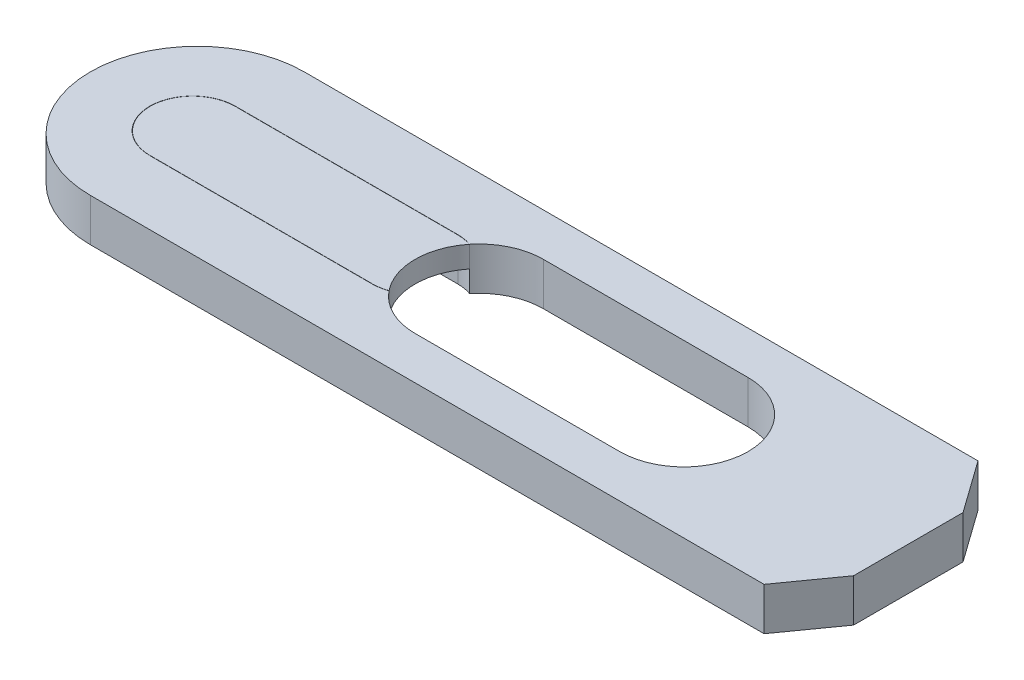
ISO-10303-21;
HEADER;
FILE_DESCRIPTION(('STEP AP214'),'2;1');
FILE_NAME('part.step','',(''),(''),'','','');
FILE_SCHEMA(('AUTOMOTIVE_DESIGN { 1 0 10303 214 1 1 1 1 }'));
ENDSEC;
DATA;
#1=APPLICATION_CONTEXT('core data for automotive mechanical design processes');
#2=APPLICATION_PROTOCOL_DEFINITION('international standard','automotive_design',2000,#1);
#3=PRODUCT_CONTEXT('',#1,'mechanical');
#4=PRODUCT('Part','Part','',(#3));
#5=PRODUCT_RELATED_PRODUCT_CATEGORY('part','',(#4));
#6=PRODUCT_DEFINITION_FORMATION('','',#4);
#7=PRODUCT_DEFINITION_CONTEXT('part definition',#1,'design');
#8=PRODUCT_DEFINITION('design','',#6,#7);
#9=PRODUCT_DEFINITION_SHAPE('','',#8);
#10=(LENGTH_UNIT() NAMED_UNIT(*) SI_UNIT(.MILLI.,.METRE.));
#11=(NAMED_UNIT(*) PLANE_ANGLE_UNIT() SI_UNIT($,.RADIAN.));
#12=(NAMED_UNIT(*) SI_UNIT($,.STERADIAN.) SOLID_ANGLE_UNIT());
#13=UNCERTAINTY_MEASURE_WITH_UNIT(LENGTH_MEASURE(1.E-05),#10,'distance_accuracy_value','');
#14=(GEOMETRIC_REPRESENTATION_CONTEXT(3) GLOBAL_UNCERTAINTY_ASSIGNED_CONTEXT((#13)) GLOBAL_UNIT_ASSIGNED_CONTEXT((#10,
#11,#12)) REPRESENTATION_CONTEXT('',''));
#15=CARTESIAN_POINT('',(0.,0.,0.));
#16=DIRECTION('',(0.,0.,1.));
#17=DIRECTION('',(1.,0.,0.));
#18=AXIS2_PLACEMENT_3D('',#15,#16,#17);
#19=CARTESIAN_POINT('',(-14.1439504513353,2.54,-2.53999999999999));
#20=DIRECTION('',(0.,1.,0.));
#21=DIRECTION('',(0.,0.,1.));
#22=AXIS2_PLACEMENT_3D('',#19,#20,#21);
#23=CYLINDRICAL_SURFACE('',#22,5.0531335518115);
#24=CARTESIAN_POINT('',(-14.1439504513353,5.08,-2.53999999999999));
#25=DIRECTION('',(0.,1.,0.));
#26=DIRECTION('',(0.,0.,1.));
#27=AXIS2_PLACEMENT_3D('',#24,#25,#26);
#28=CIRCLE('',#27,5.0531335518115);
#29=CARTESIAN_POINT('',(-14.1439504513353,5.08,2.51313355181151));
#30=VERTEX_POINT('',#29);
#31=CARTESIAN_POINT('',(-12.46848072086,5.08,2.22728013386085));
#32=VERTEX_POINT('',#31);
#33=EDGE_CURVE('E126',#30,#32,#28,.T.);
#34=ORIENTED_EDGE('',*,*,#33,.F.);
#35=DIRECTION('',(0.,1.,0.));
#36=VECTOR('',#35,1.);
#37=CARTESIAN_POINT('',(-14.1439504513353,2.54,2.51313355181151));
#38=LINE('',#37,#36);
#39=CARTESIAN_POINT('',(-14.1439504513353,2.54,2.51313355181151));
#40=VERTEX_POINT('',#39);
#41=EDGE_CURVE('E12',#40,#30,#38,.T.);
#42=ORIENTED_EDGE('',*,*,#41,.F.);
#43=CARTESIAN_POINT('',(-14.1439504513353,2.54,-2.53999999999999));
#44=DIRECTION('',(0.,1.,0.));
#45=DIRECTION('',(0.,0.,1.));
#46=AXIS2_PLACEMENT_3D('',#43,#44,#45);
#47=CIRCLE('',#46,5.0531335518115);
#48=CARTESIAN_POINT('',(-12.46848072086,2.54,2.22728013386085));
#49=VERTEX_POINT('',#48);
#50=EDGE_CURVE('E140',#40,#49,#47,.T.);
#51=ORIENTED_EDGE('',*,*,#50,.T.);
#52=DIRECTION('',(0.,1.,0.));
#53=VECTOR('',#52,1.);
#54=CARTESIAN_POINT('',(-12.46848072086,2.54,2.22728013386085));
#55=LINE('',#54,#53);
#56=EDGE_CURVE('E47',#49,#32,#55,.T.);
#57=ORIENTED_EDGE('',*,*,#56,.T.);
#58=EDGE_LOOP('',(#34,#42,#51,#57));
#59=FACE_BOUND('',#58,.T.);
#60=ADVANCED_FACE('F44',(#59),#23,.T.);
#61=CARTESIAN_POINT('',(0.,2.54,2.51313355181151));
#62=DIRECTION('',(0.,0.,1.));
#63=DIRECTION('',(1.,0.,0.));
#64=AXIS2_PLACEMENT_3D('',#61,#62,#63);
#65=PLANE('',#64);
#66=DIRECTION('',(1.,0.,0.));
#67=VECTOR('',#66,1.);
#68=CARTESIAN_POINT('',(0.,5.08,2.51313355181151));
#69=LINE('',#68,#67);
#70=CARTESIAN_POINT('',(-40.5569001419426,5.08,2.51313355181151));
#71=VERTEX_POINT('',#70);
#72=EDGE_CURVE('E138',#71,#30,#69,.T.);
#73=ORIENTED_EDGE('',*,*,#72,.F.);
#74=DIRECTION('',(0.,1.,0.));
#75=VECTOR('',#74,1.);
#76=CARTESIAN_POINT('',(-40.5569001419426,2.54,2.51313355181151));
#77=LINE('',#76,#75);
#78=CARTESIAN_POINT('',(-40.5569001419426,2.54,2.51313355181151));
#79=VERTEX_POINT('',#78);
#80=EDGE_CURVE('E53',#79,#71,#77,.T.);
#81=ORIENTED_EDGE('',*,*,#80,.F.);
#82=DIRECTION('',(1.,0.,0.));
#83=VECTOR('',#82,1.);
#84=CARTESIAN_POINT('',(0.,2.54,2.51313355181151));
#85=LINE('',#84,#83);
#86=EDGE_CURVE('E121',#79,#40,#85,.T.);
#87=ORIENTED_EDGE('',*,*,#86,.T.);
#88=ORIENTED_EDGE('',*,*,#41,.T.);
#89=EDGE_LOOP('',(#73,#81,#87,#88));
#90=FACE_BOUND('',#89,.T.);
#91=ADVANCED_FACE('F150',(#90),#65,.T.);
#92=CARTESIAN_POINT('',(-40.5569001419426,2.54,-2.53999999999999));
#93=DIRECTION('',(0.,1.,0.));
#94=DIRECTION('',(0.,0.,1.));
#95=AXIS2_PLACEMENT_3D('',#92,#93,#94);
#96=CYLINDRICAL_SURFACE('',#95,5.0531335518115);
#97=CARTESIAN_POINT('',(-40.5569001419426,5.08,-2.53999999999999));
#98=DIRECTION('',(0.,1.,0.));
#99=DIRECTION('',(0.,0.,1.));
#100=AXIS2_PLACEMENT_3D('',#97,#98,#99);
#101=CIRCLE('',#100,5.0531335518115);
#102=CARTESIAN_POINT('',(-40.5569001419426,5.08,-7.59313355181149));
#103=VERTEX_POINT('',#102);
#104=EDGE_CURVE('E108',#103,#71,#101,.T.);
#105=ORIENTED_EDGE('',*,*,#104,.F.);
#106=DIRECTION('',(0.,1.,0.));
#107=VECTOR('',#106,1.);
#108=CARTESIAN_POINT('',(-40.5569001419426,2.54,-7.59313355181149));
#109=LINE('',#108,#107);
#110=CARTESIAN_POINT('',(-40.5569001419426,2.54,-7.59313355181149));
#111=VERTEX_POINT('',#110);
#112=EDGE_CURVE('E102',#111,#103,#109,.T.);
#113=ORIENTED_EDGE('',*,*,#112,.F.);
#114=CARTESIAN_POINT('',(-40.5569001419426,2.54,-2.53999999999999));
#115=DIRECTION('',(0.,1.,0.));
#116=DIRECTION('',(0.,0.,1.));
#117=AXIS2_PLACEMENT_3D('',#114,#115,#116);
#118=CIRCLE('',#117,5.0531335518115);
#119=EDGE_CURVE('E106',#111,#79,#118,.T.);
#120=ORIENTED_EDGE('',*,*,#119,.T.);
#121=ORIENTED_EDGE('',*,*,#80,.T.);
#122=EDGE_LOOP('',(#105,#113,#120,#121));
#123=FACE_BOUND('',#122,.T.);
#124=ADVANCED_FACE('F104',(#123),#96,.T.);
#125=CARTESIAN_POINT('',(0.,2.54,-7.59313355181149));
#126=DIRECTION('',(0.,0.,1.));
#127=DIRECTION('',(1.,0.,0.));
#128=AXIS2_PLACEMENT_3D('',#125,#126,#127);
#129=PLANE('',#128);
#130=DIRECTION('',(1.,0.,0.));
#131=VECTOR('',#130,1.);
#132=CARTESIAN_POINT('',(0.,5.08,-7.59313355181149));
#133=LINE('',#132,#131);
#134=CARTESIAN_POINT('',(-14.1439504513353,5.08,-7.59313355181149));
#135=VERTEX_POINT('',#134);
#136=EDGE_CURVE('E135',#103,#135,#133,.T.);
#137=ORIENTED_EDGE('',*,*,#136,.T.);
#138=DIRECTION('',(0.,1.,0.));
#139=VECTOR('',#138,1.);
#140=CARTESIAN_POINT('',(-14.1439504513353,2.54,-7.59313355181149));
#141=LINE('',#140,#139);
#142=CARTESIAN_POINT('',(-14.1439504513353,2.54,-7.59313355181149));
#143=VERTEX_POINT('',#142);
#144=EDGE_CURVE('E112',#143,#135,#141,.T.);
#145=ORIENTED_EDGE('',*,*,#144,.F.);
#146=DIRECTION('',(1.,0.,0.));
#147=VECTOR('',#146,1.);
#148=CARTESIAN_POINT('',(0.,2.54,-7.59313355181149));
#149=LINE('',#148,#147);
#150=EDGE_CURVE('E115',#111,#143,#149,.T.);
#151=ORIENTED_EDGE('',*,*,#150,.F.);
#152=ORIENTED_EDGE('',*,*,#112,.T.);
#153=EDGE_LOOP('',(#137,#145,#151,#152));
#154=FACE_BOUND('',#153,.T.);
#155=ADVANCED_FACE('F116',(#154),#129,.F.);
#156=CARTESIAN_POINT('',(-14.1439504513353,2.54,-2.53999999999999));
#157=DIRECTION('',(0.,1.,0.));
#158=DIRECTION('',(0.,0.,1.));
#159=AXIS2_PLACEMENT_3D('',#156,#157,#158);
#160=CYLINDRICAL_SURFACE('',#159,5.0531335518115);
#161=CARTESIAN_POINT('',(-14.1439504513353,5.08,-2.53999999999999));
#162=DIRECTION('',(0.,1.,0.));
#163=DIRECTION('',(0.,0.,1.));
#164=AXIS2_PLACEMENT_3D('',#161,#162,#163);
#165=CIRCLE('',#164,5.0531335518115);
#166=CARTESIAN_POINT('',(-12.46848072086,5.08,-7.30728013386083));
#167=VERTEX_POINT('',#166);
#168=EDGE_CURVE('E132',#167,#135,#165,.T.);
#169=ORIENTED_EDGE('',*,*,#168,.F.);
#170=DIRECTION('',(0.,1.,0.));
#171=VECTOR('',#170,1.);
#172=CARTESIAN_POINT('',(-12.46848072086,2.54,-7.30728013386083));
#173=LINE('',#172,#171);
#174=CARTESIAN_POINT('',(-12.46848072086,2.54,-7.30728013386083));
#175=VERTEX_POINT('',#174);
#176=EDGE_CURVE('E143',#175,#167,#173,.T.);
#177=ORIENTED_EDGE('',*,*,#176,.F.);
#178=CARTESIAN_POINT('',(-14.1439504513353,2.54,-2.53999999999999));
#179=DIRECTION('',(0.,1.,0.));
#180=DIRECTION('',(0.,0.,1.));
#181=AXIS2_PLACEMENT_3D('',#178,#179,#180);
#182=CIRCLE('',#181,5.0531335518115);
#183=EDGE_CURVE('E118',#175,#143,#182,.T.);
#184=ORIENTED_EDGE('',*,*,#183,.T.);
#185=ORIENTED_EDGE('',*,*,#144,.T.);
#186=EDGE_LOOP('',(#169,#177,#184,#185));
#187=FACE_BOUND('',#186,.T.);
#188=ADVANCED_FACE('F163',(#187),#160,.T.);
#189=CARTESIAN_POINT('',(-6.52395045133528,2.54,-2.53999999999999));
#190=DIRECTION('',(0.,1.,0.));
#191=DIRECTION('',(0.,0.,1.));
#192=AXIS2_PLACEMENT_3D('',#189,#190,#191);
#193=CYLINDRICAL_SURFACE('',#192,7.62);
#194=CARTESIAN_POINT('',(-6.52395045133528,5.08,-2.53999999999999));
#195=DIRECTION('',(0.,1.,0.));
#196=DIRECTION('',(0.,0.,1.));
#197=AXIS2_PLACEMENT_3D('',#194,#195,#196);
#198=CIRCLE('',#197,7.62);
#199=EDGE_CURVE('E129',#167,#32,#198,.T.);
#200=ORIENTED_EDGE('',*,*,#199,.T.);
#201=ORIENTED_EDGE('',*,*,#56,.F.);
#202=CARTESIAN_POINT('',(-6.52395045133528,2.54,-2.53999999999999));
#203=DIRECTION('',(0.,1.,0.));
#204=DIRECTION('',(0.,0.,1.));
#205=AXIS2_PLACEMENT_3D('',#202,#203,#204);
#206=CIRCLE('',#205,7.62);
#207=EDGE_CURVE('E94',#175,#49,#206,.T.);
#208=ORIENTED_EDGE('',*,*,#207,.F.);
#209=ORIENTED_EDGE('',*,*,#176,.T.);
#210=EDGE_LOOP('',(#200,#201,#208,#209));
#211=FACE_BOUND('',#210,.T.);
#212=ADVANCED_FACE('F146',(#211),#193,.F.);
#213=CARTESIAN_POINT('',(0.,2.54,0.));
#214=DIRECTION('',(0.,1.,0.));
#215=DIRECTION('',(0.,0.,1.));
#216=AXIS2_PLACEMENT_3D('',#213,#214,#215);
#217=PLANE('',#216);
#218=ORIENTED_EDGE('',*,*,#50,.F.);
#219=ORIENTED_EDGE('',*,*,#86,.F.);
#220=ORIENTED_EDGE('',*,*,#119,.F.);
#221=ORIENTED_EDGE('',*,*,#150,.T.);
#222=ORIENTED_EDGE('',*,*,#183,.F.);
#223=ORIENTED_EDGE('',*,*,#207,.T.);
#224=EDGE_LOOP('',(#218,#219,#220,#221,#222,#223));
#225=FACE_BOUND('',#224,.T.);
#226=ADVANCED_FACE('F120',(#225),#217,.F.);
#227=CARTESIAN_POINT('',(0.,5.08,0.));
#228=DIRECTION('',(0.,1.,0.));
#229=DIRECTION('',(0.,0.,1.));
#230=AXIS2_PLACEMENT_3D('',#227,#228,#229);
#231=PLANE('',#230);
#232=ORIENTED_EDGE('',*,*,#33,.T.);
#233=ORIENTED_EDGE('',*,*,#199,.F.);
#234=ORIENTED_EDGE('',*,*,#168,.T.);
#235=ORIENTED_EDGE('',*,*,#136,.F.);
#236=ORIENTED_EDGE('',*,*,#104,.T.);
#237=ORIENTED_EDGE('',*,*,#72,.T.);
#238=EDGE_LOOP('',(#232,#233,#234,#235,#236,#237));
#239=FACE_BOUND('',#238,.T.);
#240=ADVANCED_FACE('F149',(#239),#231,.T.);
#241=CLOSED_SHELL('',(#60,#91,#124,#155,#188,#212,#226,#240));
#242=MANIFOLD_SOLID_BREP('B2',#241);
#243=CARTESIAN_POINT('',(-40.005,5.08,-2.53999999999999));
#244=DIRECTION('',(0.,-1.,0.));
#245=DIRECTION('',(0.,0.,-1.));
#246=AXIS2_PLACEMENT_3D('',#243,#244,#245);
#247=CYLINDRICAL_SURFACE('',#246,12.7);
#248=CARTESIAN_POINT('',(-40.005,0.,-2.53999999999999));
#249=DIRECTION('',(0.,1.,0.));
#250=DIRECTION('',(0.,0.,1.));
#251=AXIS2_PLACEMENT_3D('',#248,#249,#250);
#252=CIRCLE('',#251,12.7);
#253=CARTESIAN_POINT('',(-40.005,0.,-15.24));
#254=VERTEX_POINT('',#253);
#255=CARTESIAN_POINT('',(-40.005,0.,10.16));
#256=VERTEX_POINT('',#255);
#257=EDGE_CURVE('E353',#254,#256,#252,.T.);
#258=ORIENTED_EDGE('',*,*,#257,.T.);
#259=DIRECTION('',(0.,-1.,0.));
#260=VECTOR('',#259,1.);
#261=CARTESIAN_POINT('',(-40.005,5.08,10.16));
#262=LINE('',#261,#260);
#263=CARTESIAN_POINT('',(-40.005,5.08,10.16));
#264=VERTEX_POINT('',#263);
#265=EDGE_CURVE('E42',#264,#256,#262,.T.);
#266=ORIENTED_EDGE('',*,*,#265,.F.);
#267=CARTESIAN_POINT('',(-40.005,5.08,-2.53999999999999));
#268=DIRECTION('',(0.,1.,0.));
#269=DIRECTION('',(0.,0.,1.));
#270=AXIS2_PLACEMENT_3D('',#267,#268,#269);
#271=CIRCLE('',#270,12.7);
#272=CARTESIAN_POINT('',(-40.005,5.08,-15.24));
#273=VERTEX_POINT('',#272);
#274=EDGE_CURVE('E354',#273,#264,#271,.T.);
#275=ORIENTED_EDGE('',*,*,#274,.F.);
#276=DIRECTION('',(0.,-1.,0.));
#277=VECTOR('',#276,1.);
#278=CARTESIAN_POINT('',(-40.005,5.08,-15.24));
#279=LINE('',#278,#277);
#280=EDGE_CURVE('E348',#273,#254,#279,.T.);
#281=ORIENTED_EDGE('',*,*,#280,.T.);
#282=EDGE_LOOP('',(#258,#266,#275,#281));
#283=FACE_BOUND('',#282,.T.);
#284=ADVANCED_FACE('F219',(#283),#247,.T.);
#285=CARTESIAN_POINT('',(40.005,5.08,10.16));
#286=DIRECTION('',(0.,0.,-1.));
#287=DIRECTION('',(-1.,0.,0.));
#288=AXIS2_PLACEMENT_3D('',#285,#286,#287);
#289=PLANE('',#288);
#290=DIRECTION('',(1.,0.,0.));
#291=VECTOR('',#290,1.);
#292=CARTESIAN_POINT('',(40.005,0.,10.16));
#293=LINE('',#292,#291);
#294=CARTESIAN_POINT('',(40.005,0.,10.16));
#295=VERTEX_POINT('',#294);
#296=EDGE_CURVE('E355',#256,#295,#293,.T.);
#297=ORIENTED_EDGE('',*,*,#296,.T.);
#298=DIRECTION('',(0.,-1.,0.));
#299=VECTOR('',#298,1.);
#300=CARTESIAN_POINT('',(40.005,5.08,10.16));
#301=LINE('',#300,#299);
#302=CARTESIAN_POINT('',(40.005,5.08,10.16));
#303=VERTEX_POINT('',#302);
#304=EDGE_CURVE('E226',#303,#295,#301,.T.);
#305=ORIENTED_EDGE('',*,*,#304,.F.);
#306=DIRECTION('',(1.,0.,0.));
#307=VECTOR('',#306,1.);
#308=CARTESIAN_POINT('',(40.005,5.08,10.16));
#309=LINE('',#308,#307);
#310=EDGE_CURVE('E358',#264,#303,#309,.T.);
#311=ORIENTED_EDGE('',*,*,#310,.F.);
#312=ORIENTED_EDGE('',*,*,#265,.T.);
#313=EDGE_LOOP('',(#297,#305,#311,#312));
#314=FACE_BOUND('',#313,.T.);
#315=ADVANCED_FACE('F374',(#314),#289,.F.);
#316=CARTESIAN_POINT('',(40.005,5.08,-15.24));
#317=DIRECTION('',(0.,0.,1.));
#318=DIRECTION('',(1.,0.,0.));
#319=AXIS2_PLACEMENT_3D('',#316,#317,#318);
#320=PLANE('',#319);
#321=DIRECTION('',(-1.,0.,0.));
#322=VECTOR('',#321,1.);
#323=CARTESIAN_POINT('',(40.005,0.,-15.24));
#324=LINE('',#323,#322);
#325=CARTESIAN_POINT('',(40.005,0.,-15.24));
#326=VERTEX_POINT('',#325);
#327=EDGE_CURVE('E345',#326,#254,#324,.T.);
#328=ORIENTED_EDGE('',*,*,#327,.T.);
#329=ORIENTED_EDGE('',*,*,#280,.F.);
#330=DIRECTION('',(-1.,0.,0.));
#331=VECTOR('',#330,1.);
#332=CARTESIAN_POINT('',(40.005,5.08,-15.24));
#333=LINE('',#332,#331);
#334=CARTESIAN_POINT('',(40.005,5.08,-15.24));
#335=VERTEX_POINT('',#334);
#336=EDGE_CURVE('E347',#335,#273,#333,.T.);
#337=ORIENTED_EDGE('',*,*,#336,.F.);
#338=DIRECTION('',(0.,-1.,0.));
#339=VECTOR('',#338,1.);
#340=CARTESIAN_POINT('',(40.005,5.08,-15.24));
#341=LINE('',#340,#339);
#342=EDGE_CURVE('E334',#335,#326,#341,.T.);
#343=ORIENTED_EDGE('',*,*,#342,.T.);
#344=EDGE_LOOP('',(#328,#329,#337,#343));
#345=FACE_BOUND('',#344,.T.);
#346=ADVANCED_FACE('F343',(#345),#320,.F.);
#347=CARTESIAN_POINT('',(-40.005,5.08,-2.53999999999999));
#348=DIRECTION('',(0.,1.,0.));
#349=DIRECTION('',(0.,0.,1.));
#350=AXIS2_PLACEMENT_3D('',#347,#348,#349);
#351=PLANE('',#350);
#352=DIRECTION('',(-0.580878076124572,0.,0.813990577757394));
#353=VECTOR('',#352,1.);
#354=CARTESIAN_POINT('',(44.4312909400692,5.08,3.95739179748865));
#355=LINE('',#354,#353);
#356=CARTESIAN_POINT('',(44.4312909400692,5.08,3.95739179748865));
#357=VERTEX_POINT('',#356);
#358=EDGE_CURVE('E339',#357,#303,#355,.T.);
#359=ORIENTED_EDGE('',*,*,#358,.F.);
#360=DIRECTION('',(0.,0.,1.));
#361=VECTOR('',#360,1.);
#362=CARTESIAN_POINT('',(44.4312909400692,5.08,-9.03739179748866));
#363=LINE('',#362,#361);
#364=CARTESIAN_POINT('',(44.4312909400692,5.08,-9.03739179748866));
#365=VERTEX_POINT('',#364);
#366=EDGE_CURVE('E463',#365,#357,#363,.T.);
#367=ORIENTED_EDGE('',*,*,#366,.F.);
#368=DIRECTION('',(0.580878076124572,0.,0.813990577757394));
#369=VECTOR('',#368,1.);
#370=CARTESIAN_POINT('',(40.005,5.08,-15.24));
#371=LINE('',#370,#369);
#372=EDGE_CURVE('E466',#335,#365,#371,.T.);
#373=ORIENTED_EDGE('',*,*,#372,.F.);
#374=ORIENTED_EDGE('',*,*,#336,.T.);
#375=ORIENTED_EDGE('',*,*,#274,.T.);
#376=ORIENTED_EDGE('',*,*,#310,.T.);
#377=EDGE_LOOP('',(#359,#367,#373,#374,#375,#376));
#378=FACE_BOUND('',#377,.T.);
#379=CARTESIAN_POINT('',(-6.52395045133528,5.08,-2.53999999999999));
#380=DIRECTION('',(0.,1.,0.));
#381=DIRECTION('',(0.,0.,1.));
#382=AXIS2_PLACEMENT_3D('',#379,#380,#381);
#383=CIRCLE('',#382,7.62);
#384=CARTESIAN_POINT('',(-6.52395045133528,5.08,-10.16));
#385=VERTEX_POINT('',#384);
#386=CARTESIAN_POINT('',(-12.4506171180019,5.08,-7.32946993123687));
#387=VERTEX_POINT('',#386);
#388=EDGE_CURVE('E241',#385,#387,#383,.T.);
#389=ORIENTED_EDGE('',*,*,#388,.F.);
#390=DIRECTION('',(-1.,0.,0.));
#391=VECTOR('',#390,1.);
#392=CARTESIAN_POINT('',(-6.52395045133528,5.08,-10.16));
#393=LINE('',#392,#391);
#394=CARTESIAN_POINT('',(17.7837493777475,5.08,-10.16));
#395=VERTEX_POINT('',#394);
#396=EDGE_CURVE('E402',#395,#385,#393,.T.);
#397=ORIENTED_EDGE('',*,*,#396,.F.);
#398=CARTESIAN_POINT('',(17.7837493777475,5.08,-2.53999999999999));
#399=DIRECTION('',(0.,1.,0.));
#400=DIRECTION('',(0.,0.,1.));
#401=AXIS2_PLACEMENT_3D('',#398,#399,#400);
#402=CIRCLE('',#401,7.62);
#403=CARTESIAN_POINT('',(17.7837493777475,5.08,5.08000000000001));
#404=VERTEX_POINT('',#403);
#405=EDGE_CURVE('E406',#404,#395,#402,.T.);
#406=ORIENTED_EDGE('',*,*,#405,.F.);
#407=DIRECTION('',(1.,0.,0.));
#408=VECTOR('',#407,1.);
#409=CARTESIAN_POINT('',(-6.52395045133528,5.08,5.08000000000001));
#410=LINE('',#409,#408);
#411=CARTESIAN_POINT('',(-6.52395045133528,5.08,5.08000000000001));
#412=VERTEX_POINT('',#411);
#413=EDGE_CURVE('E409',#412,#404,#410,.T.);
#414=ORIENTED_EDGE('',*,*,#413,.F.);
#415=CARTESIAN_POINT('',(-6.52395045133528,5.08,-2.53999999999999));
#416=DIRECTION('',(0.,1.,0.));
#417=DIRECTION('',(0.,0.,1.));
#418=AXIS2_PLACEMENT_3D('',#415,#416,#417);
#419=CIRCLE('',#418,7.62);
#420=CARTESIAN_POINT('',(-12.450617118002,5.08,2.24946993123689));
#421=VERTEX_POINT('',#420);
#422=EDGE_CURVE('E412',#421,#412,#419,.T.);
#423=ORIENTED_EDGE('',*,*,#422,.F.);
#424=CARTESIAN_POINT('',(-14.1439504513353,5.08,-2.53999999999999));
#425=DIRECTION('',(0.,1.,0.));
#426=DIRECTION('',(0.,0.,1.));
#427=AXIS2_PLACEMENT_3D('',#424,#425,#426);
#428=CIRCLE('',#427,5.08);
#429=CARTESIAN_POINT('',(-14.1439504513353,5.08,2.54000000000001));
#430=VERTEX_POINT('',#429);
#431=EDGE_CURVE('E415',#430,#421,#428,.T.);
#432=ORIENTED_EDGE('',*,*,#431,.F.);
#433=DIRECTION('',(1.,0.,0.));
#434=VECTOR('',#433,1.);
#435=CARTESIAN_POINT('',(-40.5569001419426,5.08,2.54000000000002));
#436=LINE('',#435,#434);
#437=CARTESIAN_POINT('',(-40.5569001419426,5.08,2.54000000000002));
#438=VERTEX_POINT('',#437);
#439=EDGE_CURVE('E418',#438,#430,#436,.T.);
#440=ORIENTED_EDGE('',*,*,#439,.F.);
#441=CARTESIAN_POINT('',(-40.5569001419426,5.08,-2.53999999999999));
#442=DIRECTION('',(0.,1.,0.));
#443=DIRECTION('',(0.,0.,1.));
#444=AXIS2_PLACEMENT_3D('',#441,#442,#443);
#445=CIRCLE('',#444,5.08);
#446=CARTESIAN_POINT('',(-40.5569001419426,5.08,-7.61999999999999));
#447=VERTEX_POINT('',#446);
#448=EDGE_CURVE('E421',#447,#438,#445,.T.);
#449=ORIENTED_EDGE('',*,*,#448,.F.);
#450=DIRECTION('',(-1.,0.,0.));
#451=VECTOR('',#450,1.);
#452=CARTESIAN_POINT('',(-40.5569001419426,5.08,-7.61999999999999));
#453=LINE('',#452,#451);
#454=CARTESIAN_POINT('',(-14.1439504513353,5.08,-7.61999999999999));
#455=VERTEX_POINT('',#454);
#456=EDGE_CURVE('E424',#455,#447,#453,.T.);
#457=ORIENTED_EDGE('',*,*,#456,.F.);
#458=CARTESIAN_POINT('',(-14.1439504513353,5.08,-2.53999999999999));
#459=DIRECTION('',(0.,1.,0.));
#460=DIRECTION('',(0.,0.,1.));
#461=AXIS2_PLACEMENT_3D('',#458,#459,#460);
#462=CIRCLE('',#461,5.08);
#463=EDGE_CURVE('E427',#387,#455,#462,.T.);
#464=ORIENTED_EDGE('',*,*,#463,.F.);
#465=EDGE_LOOP('',(#389,#397,#406,#414,#423,#432,#440,#449,#457,#464));
#466=FACE_BOUND('',#465,.T.);
#467=ADVANCED_FACE('F470',(#378,#466),#351,.T.);
#468=CARTESIAN_POINT('',(-40.005,0.,-2.53999999999999));
#469=DIRECTION('',(0.,1.,0.));
#470=DIRECTION('',(0.,0.,1.));
#471=AXIS2_PLACEMENT_3D('',#468,#469,#470);
#472=PLANE('',#471);
#473=DIRECTION('',(-1.,0.,0.));
#474=VECTOR('',#473,1.);
#475=CARTESIAN_POINT('',(-6.52395045133528,0.,-10.16));
#476=LINE('',#475,#474);
#477=CARTESIAN_POINT('',(17.7837493777475,0.,-10.16));
#478=VERTEX_POINT('',#477);
#479=CARTESIAN_POINT('',(-6.52395045133528,0.,-10.16));
#480=VERTEX_POINT('',#479);
#481=EDGE_CURVE('E387',#478,#480,#476,.T.);
#482=ORIENTED_EDGE('',*,*,#481,.T.);
#483=CARTESIAN_POINT('',(-6.52395045133528,0.,-2.53999999999999));
#484=DIRECTION('',(0.,1.,0.));
#485=DIRECTION('',(0.,0.,1.));
#486=AXIS2_PLACEMENT_3D('',#483,#484,#485);
#487=CIRCLE('',#486,7.62);
#488=CARTESIAN_POINT('',(-12.4506171180019,0.,-7.32946993123687));
#489=VERTEX_POINT('',#488);
#490=EDGE_CURVE('E405',#480,#489,#487,.T.);
#491=ORIENTED_EDGE('',*,*,#490,.T.);
#492=CARTESIAN_POINT('',(-14.1439504513353,0.,-2.53999999999999));
#493=DIRECTION('',(0.,1.,0.));
#494=DIRECTION('',(0.,0.,1.));
#495=AXIS2_PLACEMENT_3D('',#492,#493,#494);
#496=CIRCLE('',#495,5.08);
#497=CARTESIAN_POINT('',(-14.1439504513353,0.,-7.61999999999999));
#498=VERTEX_POINT('',#497);
#499=EDGE_CURVE('E455',#489,#498,#496,.T.);
#500=ORIENTED_EDGE('',*,*,#499,.T.);
#501=DIRECTION('',(-1.,0.,0.));
#502=VECTOR('',#501,1.);
#503=CARTESIAN_POINT('',(-40.5569001419426,0.,-7.61999999999999));
#504=LINE('',#503,#502);
#505=CARTESIAN_POINT('',(-40.5569001419426,0.,-7.61999999999999));
#506=VERTEX_POINT('',#505);
#507=EDGE_CURVE('E452',#498,#506,#504,.T.);
#508=ORIENTED_EDGE('',*,*,#507,.T.);
#509=CARTESIAN_POINT('',(-40.5569001419426,0.,-2.53999999999999));
#510=DIRECTION('',(0.,1.,0.));
#511=DIRECTION('',(0.,0.,1.));
#512=AXIS2_PLACEMENT_3D('',#509,#510,#511);
#513=CIRCLE('',#512,5.08);
#514=CARTESIAN_POINT('',(-40.5569001419426,0.,2.54000000000002));
#515=VERTEX_POINT('',#514);
#516=EDGE_CURVE('E449',#506,#515,#513,.T.);
#517=ORIENTED_EDGE('',*,*,#516,.T.);
#518=DIRECTION('',(1.,0.,0.));
#519=VECTOR('',#518,1.);
#520=CARTESIAN_POINT('',(-40.5569001419426,0.,2.54000000000002));
#521=LINE('',#520,#519);
#522=CARTESIAN_POINT('',(-14.1439504513353,0.,2.54000000000001));
#523=VERTEX_POINT('',#522);
#524=EDGE_CURVE('E446',#515,#523,#521,.T.);
#525=ORIENTED_EDGE('',*,*,#524,.T.);
#526=CARTESIAN_POINT('',(-14.1439504513353,0.,-2.53999999999999));
#527=DIRECTION('',(0.,1.,0.));
#528=DIRECTION('',(0.,0.,1.));
#529=AXIS2_PLACEMENT_3D('',#526,#527,#528);
#530=CIRCLE('',#529,5.08);
#531=CARTESIAN_POINT('',(-12.450617118002,0.,2.24946993123689));
#532=VERTEX_POINT('',#531);
#533=EDGE_CURVE('E443',#523,#532,#530,.T.);
#534=ORIENTED_EDGE('',*,*,#533,.T.);
#535=CARTESIAN_POINT('',(-6.52395045133528,0.,-2.53999999999999));
#536=DIRECTION('',(0.,1.,0.));
#537=DIRECTION('',(0.,0.,1.));
#538=AXIS2_PLACEMENT_3D('',#535,#536,#537);
#539=CIRCLE('',#538,7.62);
#540=CARTESIAN_POINT('',(-6.52395045133528,0.,5.08000000000001));
#541=VERTEX_POINT('',#540);
#542=EDGE_CURVE('E440',#532,#541,#539,.T.);
#543=ORIENTED_EDGE('',*,*,#542,.T.);
#544=DIRECTION('',(1.,0.,0.));
#545=VECTOR('',#544,1.);
#546=CARTESIAN_POINT('',(-6.52395045133528,0.,5.08000000000001));
#547=LINE('',#546,#545);
#548=CARTESIAN_POINT('',(17.7837493777475,0.,5.08000000000001));
#549=VERTEX_POINT('',#548);
#550=EDGE_CURVE('E437',#541,#549,#547,.T.);
#551=ORIENTED_EDGE('',*,*,#550,.T.);
#552=CARTESIAN_POINT('',(17.7837493777475,0.,-2.53999999999999));
#553=DIRECTION('',(0.,1.,0.));
#554=DIRECTION('',(0.,0.,1.));
#555=AXIS2_PLACEMENT_3D('',#552,#553,#554);
#556=CIRCLE('',#555,7.62);
#557=EDGE_CURVE('E434',#549,#478,#556,.T.);
#558=ORIENTED_EDGE('',*,*,#557,.T.);
#559=EDGE_LOOP('',(#482,#491,#500,#508,#517,#525,#534,#543,#551,#558));
#560=FACE_BOUND('',#559,.T.);
#561=DIRECTION('',(0.,0.,1.));
#562=VECTOR('',#561,1.);
#563=CARTESIAN_POINT('',(44.4312909400692,0.,-9.03739179748866));
#564=LINE('',#563,#562);
#565=CARTESIAN_POINT('',(44.4312909400692,0.,-9.03739179748866));
#566=VERTEX_POINT('',#565);
#567=CARTESIAN_POINT('',(44.4312909400692,0.,3.95739179748865));
#568=VERTEX_POINT('',#567);
#569=EDGE_CURVE('E233',#566,#568,#564,.T.);
#570=ORIENTED_EDGE('',*,*,#569,.T.);
#571=DIRECTION('',(-0.580878076124572,0.,0.813990577757394));
#572=VECTOR('',#571,1.);
#573=CARTESIAN_POINT('',(44.4312909400692,0.,3.95739179748865));
#574=LINE('',#573,#572);
#575=EDGE_CURVE('E369',#568,#295,#574,.T.);
#576=ORIENTED_EDGE('',*,*,#575,.T.);
#577=ORIENTED_EDGE('',*,*,#296,.F.);
#578=ORIENTED_EDGE('',*,*,#257,.F.);
#579=ORIENTED_EDGE('',*,*,#327,.F.);
#580=DIRECTION('',(0.580878076124572,0.,0.813990577757394));
#581=VECTOR('',#580,1.);
#582=CARTESIAN_POINT('',(40.005,0.,-15.24));
#583=LINE('',#582,#581);
#584=EDGE_CURVE('E330',#326,#566,#583,.T.);
#585=ORIENTED_EDGE('',*,*,#584,.T.);
#586=EDGE_LOOP('',(#570,#576,#577,#578,#579,#585));
#587=FACE_BOUND('',#586,.T.);
#588=ADVANCED_FACE('F351',(#560,#587),#472,.F.);
#589=CARTESIAN_POINT('',(-6.52395045133528,0.,-2.53999999999999));
#590=DIRECTION('',(0.,1.,0.));
#591=DIRECTION('',(0.,0.,1.));
#592=AXIS2_PLACEMENT_3D('',#589,#590,#591);
#593=CYLINDRICAL_SURFACE('',#592,7.62);
#594=ORIENTED_EDGE('',*,*,#388,.T.);
#595=DIRECTION('',(0.,1.,0.));
#596=VECTOR('',#595,1.);
#597=CARTESIAN_POINT('',(-12.4506171180019,0.,-7.32946993123687));
#598=LINE('',#597,#596);
#599=EDGE_CURVE('E384',#489,#387,#598,.T.);
#600=ORIENTED_EDGE('',*,*,#599,.F.);
#601=ORIENTED_EDGE('',*,*,#490,.F.);
#602=DIRECTION('',(0.,1.,0.));
#603=VECTOR('',#602,1.);
#604=CARTESIAN_POINT('',(-6.52395045133528,0.,-10.16));
#605=LINE('',#604,#603);
#606=EDGE_CURVE('E378',#480,#385,#605,.T.);
#607=ORIENTED_EDGE('',*,*,#606,.T.);
#608=EDGE_LOOP('',(#594,#600,#601,#607));
#609=FACE_BOUND('',#608,.T.);
#610=ADVANCED_FACE('F493',(#609),#593,.F.);
#611=CARTESIAN_POINT('',(-6.52395045133528,0.,-10.16));
#612=DIRECTION('',(0.,0.,-1.));
#613=DIRECTION('',(-1.,0.,0.));
#614=AXIS2_PLACEMENT_3D('',#611,#612,#613);
#615=PLANE('',#614);
#616=ORIENTED_EDGE('',*,*,#396,.T.);
#617=ORIENTED_EDGE('',*,*,#606,.F.);
#618=ORIENTED_EDGE('',*,*,#481,.F.);
#619=DIRECTION('',(0.,1.,0.));
#620=VECTOR('',#619,1.);
#621=CARTESIAN_POINT('',(17.7837493777475,0.,-10.16));
#622=LINE('',#621,#620);
#623=EDGE_CURVE('E379',#478,#395,#622,.T.);
#624=ORIENTED_EDGE('',*,*,#623,.T.);
#625=EDGE_LOOP('',(#616,#617,#618,#624));
#626=FACE_BOUND('',#625,.T.);
#627=ADVANCED_FACE('F499',(#626),#615,.F.);
#628=CARTESIAN_POINT('',(17.7837493777475,0.,-2.53999999999999));
#629=DIRECTION('',(0.,1.,0.));
#630=DIRECTION('',(0.,0.,1.));
#631=AXIS2_PLACEMENT_3D('',#628,#629,#630);
#632=CYLINDRICAL_SURFACE('',#631,7.62);
#633=ORIENTED_EDGE('',*,*,#405,.T.);
#634=ORIENTED_EDGE('',*,*,#623,.F.);
#635=ORIENTED_EDGE('',*,*,#557,.F.);
#636=DIRECTION('',(0.,1.,0.));
#637=VECTOR('',#636,1.);
#638=CARTESIAN_POINT('',(17.7837493777475,0.,5.08000000000001));
#639=LINE('',#638,#637);
#640=EDGE_CURVE('E399',#549,#404,#639,.T.);
#641=ORIENTED_EDGE('',*,*,#640,.T.);
#642=EDGE_LOOP('',(#633,#634,#635,#641));
#643=FACE_BOUND('',#642,.T.);
#644=ADVANCED_FACE('F526',(#643),#632,.F.);
#645=CARTESIAN_POINT('',(-6.52395045133528,0.,5.08000000000001));
#646=DIRECTION('',(0.,0.,1.));
#647=DIRECTION('',(1.,0.,0.));
#648=AXIS2_PLACEMENT_3D('',#645,#646,#647);
#649=PLANE('',#648);
#650=ORIENTED_EDGE('',*,*,#413,.T.);
#651=ORIENTED_EDGE('',*,*,#640,.F.);
#652=ORIENTED_EDGE('',*,*,#550,.F.);
#653=DIRECTION('',(0.,1.,0.));
#654=VECTOR('',#653,1.);
#655=CARTESIAN_POINT('',(-6.52395045133528,0.,5.08000000000001));
#656=LINE('',#655,#654);
#657=EDGE_CURVE('E397',#541,#412,#656,.T.);
#658=ORIENTED_EDGE('',*,*,#657,.T.);
#659=EDGE_LOOP('',(#650,#651,#652,#658));
#660=FACE_BOUND('',#659,.T.);
#661=ADVANCED_FACE('F522',(#660),#649,.F.);
#662=CARTESIAN_POINT('',(-6.52395045133528,0.,-2.53999999999999));
#663=DIRECTION('',(0.,1.,0.));
#664=DIRECTION('',(0.,0.,1.));
#665=AXIS2_PLACEMENT_3D('',#662,#663,#664);
#666=CYLINDRICAL_SURFACE('',#665,7.62);
#667=ORIENTED_EDGE('',*,*,#422,.T.);
#668=ORIENTED_EDGE('',*,*,#657,.F.);
#669=ORIENTED_EDGE('',*,*,#542,.F.);
#670=DIRECTION('',(0.,1.,0.));
#671=VECTOR('',#670,1.);
#672=CARTESIAN_POINT('',(-12.450617118002,0.,2.24946993123689));
#673=LINE('',#672,#671);
#674=EDGE_CURVE('E395',#532,#421,#673,.T.);
#675=ORIENTED_EDGE('',*,*,#674,.T.);
#676=EDGE_LOOP('',(#667,#668,#669,#675));
#677=FACE_BOUND('',#676,.T.);
#678=ADVANCED_FACE('F518',(#677),#666,.F.);
#679=CARTESIAN_POINT('',(-14.1439504513353,0.,-2.53999999999999));
#680=DIRECTION('',(0.,1.,0.));
#681=DIRECTION('',(0.,0.,1.));
#682=AXIS2_PLACEMENT_3D('',#679,#680,#681);
#683=CYLINDRICAL_SURFACE('',#682,5.08);
#684=ORIENTED_EDGE('',*,*,#431,.T.);
#685=ORIENTED_EDGE('',*,*,#674,.F.);
#686=ORIENTED_EDGE('',*,*,#533,.F.);
#687=DIRECTION('',(0.,1.,0.));
#688=VECTOR('',#687,1.);
#689=CARTESIAN_POINT('',(-14.1439504513353,0.,2.54000000000001));
#690=LINE('',#689,#688);
#691=EDGE_CURVE('E393',#523,#430,#690,.T.);
#692=ORIENTED_EDGE('',*,*,#691,.T.);
#693=EDGE_LOOP('',(#684,#685,#686,#692));
#694=FACE_BOUND('',#693,.T.);
#695=ADVANCED_FACE('F514',(#694),#683,.F.);
#696=CARTESIAN_POINT('',(-40.5569001419426,0.,2.54000000000002));
#697=DIRECTION('',(0.,0.,1.));
#698=DIRECTION('',(1.,0.,0.));
#699=AXIS2_PLACEMENT_3D('',#696,#697,#698);
#700=PLANE('',#699);
#701=ORIENTED_EDGE('',*,*,#439,.T.);
#702=ORIENTED_EDGE('',*,*,#691,.F.);
#703=ORIENTED_EDGE('',*,*,#524,.F.);
#704=DIRECTION('',(0.,1.,0.));
#705=VECTOR('',#704,1.);
#706=CARTESIAN_POINT('',(-40.5569001419426,0.,2.54000000000002));
#707=LINE('',#706,#705);
#708=EDGE_CURVE('E391',#515,#438,#707,.T.);
#709=ORIENTED_EDGE('',*,*,#708,.T.);
#710=EDGE_LOOP('',(#701,#702,#703,#709));
#711=FACE_BOUND('',#710,.T.);
#712=ADVANCED_FACE('F510',(#711),#700,.F.);
#713=CARTESIAN_POINT('',(-40.5569001419426,0.,-2.53999999999999));
#714=DIRECTION('',(0.,1.,0.));
#715=DIRECTION('',(0.,0.,1.));
#716=AXIS2_PLACEMENT_3D('',#713,#714,#715);
#717=CYLINDRICAL_SURFACE('',#716,5.08);
#718=ORIENTED_EDGE('',*,*,#448,.T.);
#719=ORIENTED_EDGE('',*,*,#708,.F.);
#720=ORIENTED_EDGE('',*,*,#516,.F.);
#721=DIRECTION('',(0.,1.,0.));
#722=VECTOR('',#721,1.);
#723=CARTESIAN_POINT('',(-40.5569001419426,0.,-7.61999999999999));
#724=LINE('',#723,#722);
#725=EDGE_CURVE('E389',#506,#447,#724,.T.);
#726=ORIENTED_EDGE('',*,*,#725,.T.);
#727=EDGE_LOOP('',(#718,#719,#720,#726));
#728=FACE_BOUND('',#727,.T.);
#729=ADVANCED_FACE('F506',(#728),#717,.F.);
#730=CARTESIAN_POINT('',(-40.5569001419426,0.,-7.61999999999999));
#731=DIRECTION('',(0.,0.,-1.));
#732=DIRECTION('',(-1.,0.,0.));
#733=AXIS2_PLACEMENT_3D('',#730,#731,#732);
#734=PLANE('',#733);
#735=ORIENTED_EDGE('',*,*,#456,.T.);
#736=ORIENTED_EDGE('',*,*,#725,.F.);
#737=ORIENTED_EDGE('',*,*,#507,.F.);
#738=DIRECTION('',(0.,1.,0.));
#739=VECTOR('',#738,1.);
#740=CARTESIAN_POINT('',(-14.1439504513353,0.,-7.61999999999999));
#741=LINE('',#740,#739);
#742=EDGE_CURVE('E386',#498,#455,#741,.T.);
#743=ORIENTED_EDGE('',*,*,#742,.T.);
#744=EDGE_LOOP('',(#735,#736,#737,#743));
#745=FACE_BOUND('',#744,.T.);
#746=ADVANCED_FACE('F502',(#745),#734,.F.);
#747=CARTESIAN_POINT('',(-14.1439504513353,0.,-2.53999999999999));
#748=DIRECTION('',(0.,1.,0.));
#749=DIRECTION('',(0.,0.,1.));
#750=AXIS2_PLACEMENT_3D('',#747,#748,#749);
#751=CYLINDRICAL_SURFACE('',#750,5.08);
#752=ORIENTED_EDGE('',*,*,#463,.T.);
#753=ORIENTED_EDGE('',*,*,#742,.F.);
#754=ORIENTED_EDGE('',*,*,#499,.F.);
#755=ORIENTED_EDGE('',*,*,#599,.T.);
#756=EDGE_LOOP('',(#752,#753,#754,#755));
#757=FACE_BOUND('',#756,.T.);
#758=ADVANCED_FACE('F480',(#757),#751,.F.);
#759=CARTESIAN_POINT('',(44.4312909400692,0.,3.95739179748865));
#760=DIRECTION('',(-0.813990577757394,0.,-0.580878076124572));
#761=DIRECTION('',(-0.580878076124572,0.,0.813990577757394));
#762=AXIS2_PLACEMENT_3D('',#759,#760,#761);
#763=PLANE('',#762);
#764=ORIENTED_EDGE('',*,*,#358,.T.);
#765=ORIENTED_EDGE('',*,*,#304,.T.);
#766=ORIENTED_EDGE('',*,*,#575,.F.);
#767=DIRECTION('',(0.,1.,0.));
#768=VECTOR('',#767,1.);
#769=CARTESIAN_POINT('',(44.4312909400692,0.,3.95739179748865));
#770=LINE('',#769,#768);
#771=EDGE_CURVE('E431',#568,#357,#770,.T.);
#772=ORIENTED_EDGE('',*,*,#771,.T.);
#773=EDGE_LOOP('',(#764,#765,#766,#772));
#774=FACE_BOUND('',#773,.T.);
#775=ADVANCED_FACE('F368',(#774),#763,.F.);
#776=CARTESIAN_POINT('',(44.4312909400692,0.,-9.03739179748866));
#777=DIRECTION('',(-1.,0.,0.));
#778=DIRECTION('',(0.,0.,1.));
#779=AXIS2_PLACEMENT_3D('',#776,#777,#778);
#780=PLANE('',#779);
#781=ORIENTED_EDGE('',*,*,#366,.T.);
#782=ORIENTED_EDGE('',*,*,#771,.F.);
#783=ORIENTED_EDGE('',*,*,#569,.F.);
#784=DIRECTION('',(0.,1.,0.));
#785=VECTOR('',#784,1.);
#786=CARTESIAN_POINT('',(44.4312909400692,0.,-9.03739179748866));
#787=LINE('',#786,#785);
#788=EDGE_CURVE('E336',#566,#365,#787,.T.);
#789=ORIENTED_EDGE('',*,*,#788,.T.);
#790=EDGE_LOOP('',(#781,#782,#783,#789));
#791=FACE_BOUND('',#790,.T.);
#792=ADVANCED_FACE('F472',(#791),#780,.F.);
#793=CARTESIAN_POINT('',(40.005,0.,-15.24));
#794=DIRECTION('',(-0.813990577757394,0.,0.580878076124572));
#795=DIRECTION('',(0.580878076124572,0.,0.813990577757394));
#796=AXIS2_PLACEMENT_3D('',#793,#794,#795);
#797=PLANE('',#796);
#798=ORIENTED_EDGE('',*,*,#372,.T.);
#799=ORIENTED_EDGE('',*,*,#788,.F.);
#800=ORIENTED_EDGE('',*,*,#584,.F.);
#801=ORIENTED_EDGE('',*,*,#342,.F.);
#802=EDGE_LOOP('',(#798,#799,#800,#801));
#803=FACE_BOUND('',#802,.T.);
#804=ADVANCED_FACE('F333',(#803),#797,.F.);
#805=CLOSED_SHELL('',(#284,#315,#346,#467,#588,#610,#627,#644,#661,#678,#695,#712,#729,#746,
#758,#775,#792,#804));
#806=MANIFOLD_SOLID_BREP('B6',#805);
#807=ADVANCED_BREP_SHAPE_REPRESENTATION('',(#18,#242,#806),#14);
#808=SHAPE_DEFINITION_REPRESENTATION(#9,#807);
ENDSEC;
END-ISO-10303-21;
